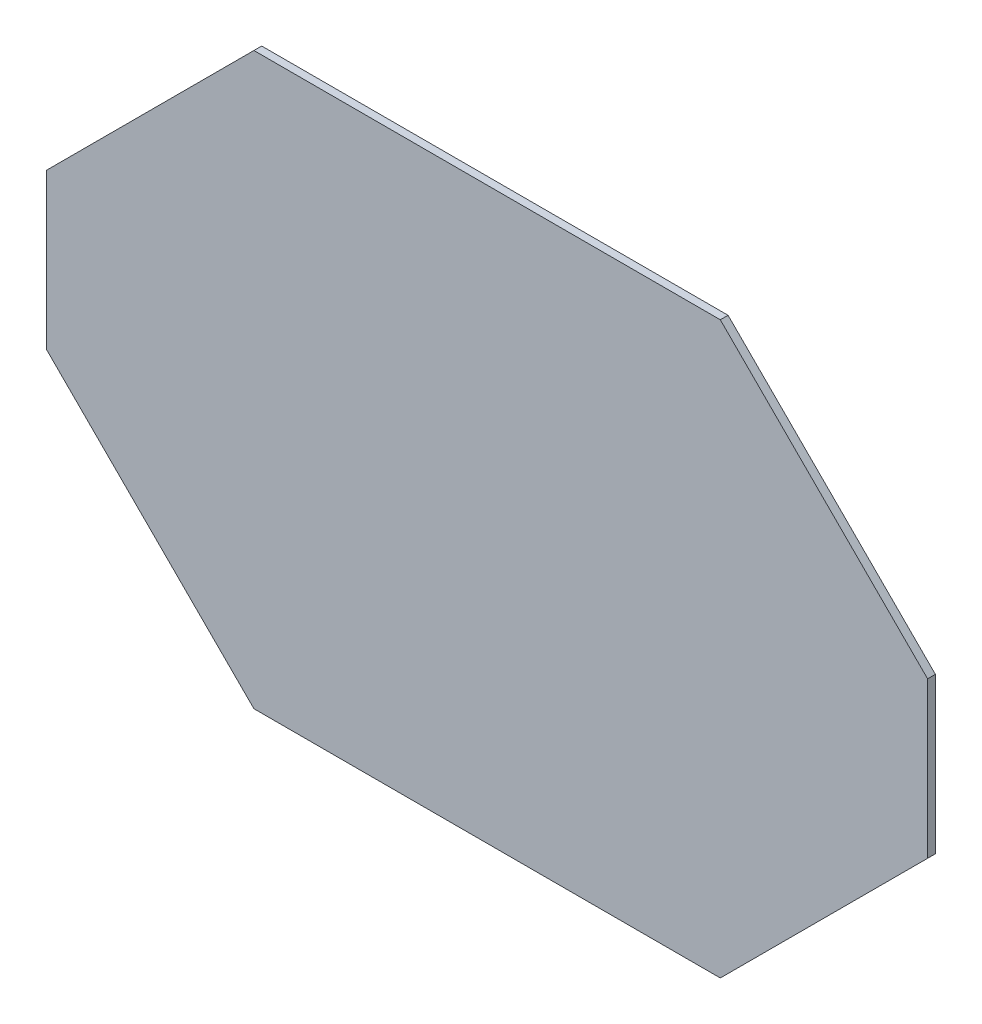
ISO-10303-21;
HEADER;
FILE_DESCRIPTION(('STEP AP214'),'2;1');
FILE_NAME('part.step','',(''),(''),'','','');
FILE_SCHEMA(('AUTOMOTIVE_DESIGN { 1 0 10303 214 1 1 1 1 }'));
ENDSEC;
DATA;
#1=APPLICATION_CONTEXT('core data for automotive mechanical design processes');
#2=APPLICATION_PROTOCOL_DEFINITION('international standard','automotive_design',2000,#1);
#3=PRODUCT_CONTEXT('',#1,'mechanical');
#4=PRODUCT('Part','Part','',(#3));
#5=PRODUCT_RELATED_PRODUCT_CATEGORY('part','',(#4));
#6=PRODUCT_DEFINITION_FORMATION('','',#4);
#7=PRODUCT_DEFINITION_CONTEXT('part definition',#1,'design');
#8=PRODUCT_DEFINITION('design','',#6,#7);
#9=PRODUCT_DEFINITION_SHAPE('','',#8);
#10=(LENGTH_UNIT() NAMED_UNIT(*) SI_UNIT(.MILLI.,.METRE.));
#11=(NAMED_UNIT(*) PLANE_ANGLE_UNIT() SI_UNIT($,.RADIAN.));
#12=(NAMED_UNIT(*) SI_UNIT($,.STERADIAN.) SOLID_ANGLE_UNIT());
#13=UNCERTAINTY_MEASURE_WITH_UNIT(LENGTH_MEASURE(1.E-05),#10,'distance_accuracy_value','');
#14=(GEOMETRIC_REPRESENTATION_CONTEXT(3) GLOBAL_UNCERTAINTY_ASSIGNED_CONTEXT((#13)) GLOBAL_UNIT_ASSIGNED_CONTEXT((#10,
#11,#12)) REPRESENTATION_CONTEXT('',''));
#15=CARTESIAN_POINT('',(0.,0.,0.));
#16=DIRECTION('',(0.,0.,1.));
#17=DIRECTION('',(1.,0.,0.));
#18=AXIS2_PLACEMENT_3D('',#15,#16,#17);
#19=CARTESIAN_POINT('',(-424.680116391853,237.887875848691,7.62));
#20=DIRECTION('',(1.,0.,0.));
#21=DIRECTION('',(0.,1.,0.));
#22=AXIS2_PLACEMENT_3D('',#19,#20,#21);
#23=PLANE('',#22);
#24=DIRECTION('',(0.,-1.,0.));
#25=VECTOR('',#24,1.);
#26=CARTESIAN_POINT('',(-424.680116391853,237.887875848691,0.));
#27=LINE('',#26,#25);
#28=CARTESIAN_POINT('',(-424.680116391853,34.6878758486907,0.));
#29=VERTEX_POINT('',#28);
#30=CARTESIAN_POINT('',(-424.680116391853,-117.712124151309,0.));
#31=VERTEX_POINT('',#30);
#32=EDGE_CURVE('E116',#29,#31,#27,.T.);
#33=ORIENTED_EDGE('',*,*,#32,.T.);
#34=DIRECTION('',(0.,0.,1.));
#35=VECTOR('',#34,1.);
#36=CARTESIAN_POINT('',(-424.680116391853,-117.712124151309,7.62));
#37=LINE('',#36,#35);
#38=CARTESIAN_POINT('',(-424.680116391853,-117.712124151309,7.62));
#39=VERTEX_POINT('',#38);
#40=EDGE_CURVE('E143',#31,#39,#37,.T.);
#41=ORIENTED_EDGE('',*,*,#40,.T.);
#42=DIRECTION('',(0.,-1.,0.));
#43=VECTOR('',#42,1.);
#44=CARTESIAN_POINT('',(-424.680116391853,237.887875848691,7.62));
#45=LINE('',#44,#43);
#46=CARTESIAN_POINT('',(-424.680116391853,34.6878758486907,7.62));
#47=VERTEX_POINT('',#46);
#48=EDGE_CURVE('E119',#47,#39,#45,.T.);
#49=ORIENTED_EDGE('',*,*,#48,.F.);
#50=DIRECTION('',(0.,0.,-1.));
#51=VECTOR('',#50,1.);
#52=CARTESIAN_POINT('',(-424.680116391853,34.6878758486907,7.62));
#53=LINE('',#52,#51);
#54=EDGE_CURVE('E108',#47,#29,#53,.T.);
#55=ORIENTED_EDGE('',*,*,#54,.T.);
#56=EDGE_LOOP('',(#33,#41,#49,#55));
#57=FACE_BOUND('',#56,.T.);
#58=ADVANCED_FACE('F37',(#57),#23,.F.);
#59=CARTESIAN_POINT('',(-424.680116391852,-320.912124151309,7.62));
#60=DIRECTION('',(0.,1.,0.));
#61=DIRECTION('',(0.,0.,1.));
#62=AXIS2_PLACEMENT_3D('',#59,#60,#61);
#63=PLANE('',#62);
#64=DIRECTION('',(1.,0.,0.));
#65=VECTOR('',#64,1.);
#66=CARTESIAN_POINT('',(-424.680116391852,-320.912124151309,0.));
#67=LINE('',#66,#65);
#68=CARTESIAN_POINT('',(-221.480116391852,-320.912124151309,0.));
#69=VERTEX_POINT('',#68);
#70=CARTESIAN_POINT('',(235.719883608147,-320.912124151309,0.));
#71=VERTEX_POINT('',#70);
#72=EDGE_CURVE('E125',#69,#71,#67,.T.);
#73=ORIENTED_EDGE('',*,*,#72,.T.);
#74=DIRECTION('',(0.,0.,1.));
#75=VECTOR('',#74,1.);
#76=CARTESIAN_POINT('',(235.719883608147,-320.912124151309,7.62));
#77=LINE('',#76,#75);
#78=CARTESIAN_POINT('',(235.719883608147,-320.912124151309,7.62));
#79=VERTEX_POINT('',#78);
#80=EDGE_CURVE('E152',#71,#79,#77,.T.);
#81=ORIENTED_EDGE('',*,*,#80,.T.);
#82=DIRECTION('',(1.,0.,0.));
#83=VECTOR('',#82,1.);
#84=CARTESIAN_POINT('',(-424.680116391852,-320.912124151309,7.62));
#85=LINE('',#84,#83);
#86=CARTESIAN_POINT('',(-221.480116391852,-320.912124151309,7.62));
#87=VERTEX_POINT('',#86);
#88=EDGE_CURVE('E171',#87,#79,#85,.T.);
#89=ORIENTED_EDGE('',*,*,#88,.F.);
#90=DIRECTION('',(0.,0.,-1.));
#91=VECTOR('',#90,1.);
#92=CARTESIAN_POINT('',(-221.480116391852,-320.912124151309,7.62));
#93=LINE('',#92,#91);
#94=EDGE_CURVE('E139',#87,#69,#93,.T.);
#95=ORIENTED_EDGE('',*,*,#94,.T.);
#96=EDGE_LOOP('',(#73,#81,#89,#95));
#97=FACE_BOUND('',#96,.T.);
#98=ADVANCED_FACE('F180',(#97),#63,.F.);
#99=CARTESIAN_POINT('',(438.919883608147,237.887875848691,7.62));
#100=DIRECTION('',(-1.,0.,0.));
#101=DIRECTION('',(0.,-1.,0.));
#102=AXIS2_PLACEMENT_3D('',#99,#100,#101);
#103=PLANE('',#102);
#104=DIRECTION('',(0.,1.,0.));
#105=VECTOR('',#104,1.);
#106=CARTESIAN_POINT('',(438.919883608147,237.887875848691,0.));
#107=LINE('',#106,#105);
#108=CARTESIAN_POINT('',(438.919883608147,-117.71212415131,0.));
#109=VERTEX_POINT('',#108);
#110=CARTESIAN_POINT('',(438.919883608147,34.68787584869,0.));
#111=VERTEX_POINT('',#110);
#112=EDGE_CURVE('E128',#109,#111,#107,.T.);
#113=ORIENTED_EDGE('',*,*,#112,.T.);
#114=DIRECTION('',(0.,0.,1.));
#115=VECTOR('',#114,1.);
#116=CARTESIAN_POINT('',(438.919883608147,34.68787584869,7.62));
#117=LINE('',#116,#115);
#118=CARTESIAN_POINT('',(438.919883608147,34.68787584869,7.62));
#119=VERTEX_POINT('',#118);
#120=EDGE_CURVE('E46',#111,#119,#117,.T.);
#121=ORIENTED_EDGE('',*,*,#120,.T.);
#122=DIRECTION('',(0.,1.,0.));
#123=VECTOR('',#122,1.);
#124=CARTESIAN_POINT('',(438.919883608147,237.887875848691,7.62));
#125=LINE('',#124,#123);
#126=CARTESIAN_POINT('',(438.919883608147,-117.71212415131,7.62));
#127=VERTEX_POINT('',#126);
#128=EDGE_CURVE('E167',#127,#119,#125,.T.);
#129=ORIENTED_EDGE('',*,*,#128,.F.);
#130=DIRECTION('',(0.,0.,-1.));
#131=VECTOR('',#130,1.);
#132=CARTESIAN_POINT('',(438.919883608147,-117.71212415131,7.62));
#133=LINE('',#132,#131);
#134=EDGE_CURVE('E147',#127,#109,#133,.T.);
#135=ORIENTED_EDGE('',*,*,#134,.T.);
#136=EDGE_LOOP('',(#113,#121,#129,#135));
#137=FACE_BOUND('',#136,.T.);
#138=ADVANCED_FACE('F184',(#137),#103,.F.);
#139=CARTESIAN_POINT('',(-424.680116391853,237.887875848691,7.62));
#140=DIRECTION('',(0.,-1.,0.));
#141=DIRECTION('',(0.,0.,-1.));
#142=AXIS2_PLACEMENT_3D('',#139,#140,#141);
#143=PLANE('',#142);
#144=DIRECTION('',(-1.,0.,0.));
#145=VECTOR('',#144,1.);
#146=CARTESIAN_POINT('',(-424.680116391853,237.887875848691,7.62));
#147=LINE('',#146,#145);
#148=CARTESIAN_POINT('',(235.719883608147,237.887875848691,7.62));
#149=VERTEX_POINT('',#148);
#150=CARTESIAN_POINT('',(-221.480116391852,237.887875848691,7.62));
#151=VERTEX_POINT('',#150);
#152=EDGE_CURVE('E120',#149,#151,#147,.T.);
#153=ORIENTED_EDGE('',*,*,#152,.F.);
#154=DIRECTION('',(0.,0.,-1.));
#155=VECTOR('',#154,1.);
#156=CARTESIAN_POINT('',(235.719883608147,237.887875848691,7.62));
#157=LINE('',#156,#155);
#158=CARTESIAN_POINT('',(235.719883608147,237.887875848691,0.));
#159=VERTEX_POINT('',#158);
#160=EDGE_CURVE('E156',#149,#159,#157,.T.);
#161=ORIENTED_EDGE('',*,*,#160,.T.);
#162=DIRECTION('',(-1.,0.,0.));
#163=VECTOR('',#162,1.);
#164=CARTESIAN_POINT('',(-424.680116391853,237.887875848691,0.));
#165=LINE('',#164,#163);
#166=CARTESIAN_POINT('',(-221.480116391852,237.887875848691,0.));
#167=VERTEX_POINT('',#166);
#168=EDGE_CURVE('E134',#159,#167,#165,.T.);
#169=ORIENTED_EDGE('',*,*,#168,.T.);
#170=DIRECTION('',(0.,0.,1.));
#171=VECTOR('',#170,1.);
#172=CARTESIAN_POINT('',(-221.480116391852,237.887875848691,7.62));
#173=LINE('',#172,#171);
#174=EDGE_CURVE('E110',#167,#151,#173,.T.);
#175=ORIENTED_EDGE('',*,*,#174,.T.);
#176=EDGE_LOOP('',(#153,#161,#169,#175));
#177=FACE_BOUND('',#176,.T.);
#178=ADVANCED_FACE('F162',(#177),#143,.F.);
#179=CARTESIAN_POINT('',(0.,0.,7.62));
#180=DIRECTION('',(0.,0.,1.));
#181=DIRECTION('',(1.,0.,0.));
#182=AXIS2_PLACEMENT_3D('',#179,#180,#181);
#183=PLANE('',#182);
#184=ORIENTED_EDGE('',*,*,#128,.T.);
#185=DIRECTION('',(0.707106781186546,-0.707106781186549,0.));
#186=VECTOR('',#185,1.);
#187=CARTESIAN_POINT('',(236.803879728419,236.803879728419,7.62));
#188=LINE('',#187,#186);
#189=EDGE_CURVE('E11',#119,#149,#188,.F.);
#190=ORIENTED_EDGE('',*,*,#189,.T.);
#191=ORIENTED_EDGE('',*,*,#152,.T.);
#192=DIRECTION('',(0.707106781186549,0.707106781186546,0.));
#193=VECTOR('',#192,1.);
#194=CARTESIAN_POINT('',(-229.683996120271,229.683996120272,7.62));
#195=LINE('',#194,#193);
#196=EDGE_CURVE('E137',#151,#47,#195,.F.);
#197=ORIENTED_EDGE('',*,*,#196,.T.);
#198=ORIENTED_EDGE('',*,*,#48,.T.);
#199=DIRECTION('',(-0.707106781186547,0.707106781186548,0.));
#200=VECTOR('',#199,1.);
#201=CARTESIAN_POINT('',(-271.196120271581,-271.19612027158,7.62));
#202=LINE('',#201,#200);
#203=EDGE_CURVE('E145',#39,#87,#202,.F.);
#204=ORIENTED_EDGE('',*,*,#203,.T.);
#205=ORIENTED_EDGE('',*,*,#88,.T.);
#206=DIRECTION('',(-0.707106781186549,-0.707106781186546,0.));
#207=VECTOR('',#206,1.);
#208=CARTESIAN_POINT('',(278.316003879727,-278.316003879729,7.62));
#209=LINE('',#208,#207);
#210=EDGE_CURVE('E154',#79,#127,#209,.F.);
#211=ORIENTED_EDGE('',*,*,#210,.T.);
#212=EDGE_LOOP('',(#184,#190,#191,#197,#198,#204,#205,#211));
#213=FACE_BOUND('',#212,.T.);
#214=ADVANCED_FACE('F166',(#213),#183,.T.);
#215=CARTESIAN_POINT('',(0.,0.,0.));
#216=DIRECTION('',(0.,0.,1.));
#217=DIRECTION('',(1.,0.,0.));
#218=AXIS2_PLACEMENT_3D('',#215,#216,#217);
#219=PLANE('',#218);
#220=ORIENTED_EDGE('',*,*,#168,.F.);
#221=DIRECTION('',(-0.707106781186546,0.707106781186549,0.));
#222=VECTOR('',#221,1.);
#223=CARTESIAN_POINT('',(235.719883608147,237.887875848691,0.));
#224=LINE('',#223,#222);
#225=EDGE_CURVE('E60',#159,#111,#224,.F.);
#226=ORIENTED_EDGE('',*,*,#225,.T.);
#227=ORIENTED_EDGE('',*,*,#112,.F.);
#228=DIRECTION('',(0.707106781186549,0.707106781186546,0.));
#229=VECTOR('',#228,1.);
#230=CARTESIAN_POINT('',(438.919883608147,-117.71212415131,0.));
#231=LINE('',#230,#229);
#232=EDGE_CURVE('E150',#109,#71,#231,.F.);
#233=ORIENTED_EDGE('',*,*,#232,.T.);
#234=ORIENTED_EDGE('',*,*,#72,.F.);
#235=DIRECTION('',(0.707106781186547,-0.707106781186548,0.));
#236=VECTOR('',#235,1.);
#237=CARTESIAN_POINT('',(-221.480116391852,-320.912124151309,0.));
#238=LINE('',#237,#236);
#239=EDGE_CURVE('E124',#69,#31,#238,.F.);
#240=ORIENTED_EDGE('',*,*,#239,.T.);
#241=ORIENTED_EDGE('',*,*,#32,.F.);
#242=DIRECTION('',(-0.707106781186549,-0.707106781186546,0.));
#243=VECTOR('',#242,1.);
#244=CARTESIAN_POINT('',(-424.680116391853,34.6878758486907,0.));
#245=LINE('',#244,#243);
#246=EDGE_CURVE('E104',#29,#167,#245,.F.);
#247=ORIENTED_EDGE('',*,*,#246,.T.);
#248=EDGE_LOOP('',(#220,#226,#227,#233,#234,#240,#241,#247));
#249=FACE_BOUND('',#248,.T.);
#250=ADVANCED_FACE('F122',(#249),#219,.F.);
#251=CARTESIAN_POINT('',(-424.680116391853,34.6878758486907,7.62));
#252=DIRECTION('',(0.707106781186546,-0.707106781186549,0.));
#253=DIRECTION('',(0.,0.,-1.));
#254=AXIS2_PLACEMENT_3D('',#251,#252,#253);
#255=PLANE('',#254);
#256=ORIENTED_EDGE('',*,*,#196,.F.);
#257=ORIENTED_EDGE('',*,*,#174,.F.);
#258=ORIENTED_EDGE('',*,*,#246,.F.);
#259=ORIENTED_EDGE('',*,*,#54,.F.);
#260=EDGE_LOOP('',(#256,#257,#258,#259));
#261=FACE_BOUND('',#260,.T.);
#262=ADVANCED_FACE('F107',(#261),#255,.F.);
#263=CARTESIAN_POINT('',(-221.480116391852,-320.912124151309,7.62));
#264=DIRECTION('',(0.707106781186548,0.707106781186547,0.));
#265=DIRECTION('',(0.,0.,-1.));
#266=AXIS2_PLACEMENT_3D('',#263,#264,#265);
#267=PLANE('',#266);
#268=ORIENTED_EDGE('',*,*,#203,.F.);
#269=ORIENTED_EDGE('',*,*,#40,.F.);
#270=ORIENTED_EDGE('',*,*,#239,.F.);
#271=ORIENTED_EDGE('',*,*,#94,.F.);
#272=EDGE_LOOP('',(#268,#269,#270,#271));
#273=FACE_BOUND('',#272,.T.);
#274=ADVANCED_FACE('F178',(#273),#267,.F.);
#275=CARTESIAN_POINT('',(438.919883608147,-117.71212415131,7.62));
#276=DIRECTION('',(-0.707106781186546,0.707106781186549,0.));
#277=DIRECTION('',(0.,0.,-1.));
#278=AXIS2_PLACEMENT_3D('',#275,#276,#277);
#279=PLANE('',#278);
#280=ORIENTED_EDGE('',*,*,#210,.F.);
#281=ORIENTED_EDGE('',*,*,#80,.F.);
#282=ORIENTED_EDGE('',*,*,#232,.F.);
#283=ORIENTED_EDGE('',*,*,#134,.F.);
#284=EDGE_LOOP('',(#280,#281,#282,#283));
#285=FACE_BOUND('',#284,.T.);
#286=ADVANCED_FACE('F183',(#285),#279,.F.);
#287=CARTESIAN_POINT('',(235.719883608147,237.887875848691,7.62));
#288=DIRECTION('',(-0.707106781186549,-0.707106781186546,0.));
#289=DIRECTION('',(0.,0.,-1.));
#290=AXIS2_PLACEMENT_3D('',#287,#288,#289);
#291=PLANE('',#290);
#292=ORIENTED_EDGE('',*,*,#189,.F.);
#293=ORIENTED_EDGE('',*,*,#120,.F.);
#294=ORIENTED_EDGE('',*,*,#225,.F.);
#295=ORIENTED_EDGE('',*,*,#160,.F.);
#296=EDGE_LOOP('',(#292,#293,#294,#295));
#297=FACE_BOUND('',#296,.T.);
#298=ADVANCED_FACE('F40',(#297),#291,.F.);
#299=CLOSED_SHELL('',(#58,#98,#138,#178,#214,#250,#262,#274,#286,#298));
#300=MANIFOLD_SOLID_BREP('B2',#299);
#301=ADVANCED_BREP_SHAPE_REPRESENTATION('',(#18,#300),#14);
#302=SHAPE_DEFINITION_REPRESENTATION(#9,#301);
ENDSEC;
END-ISO-10303-21;
